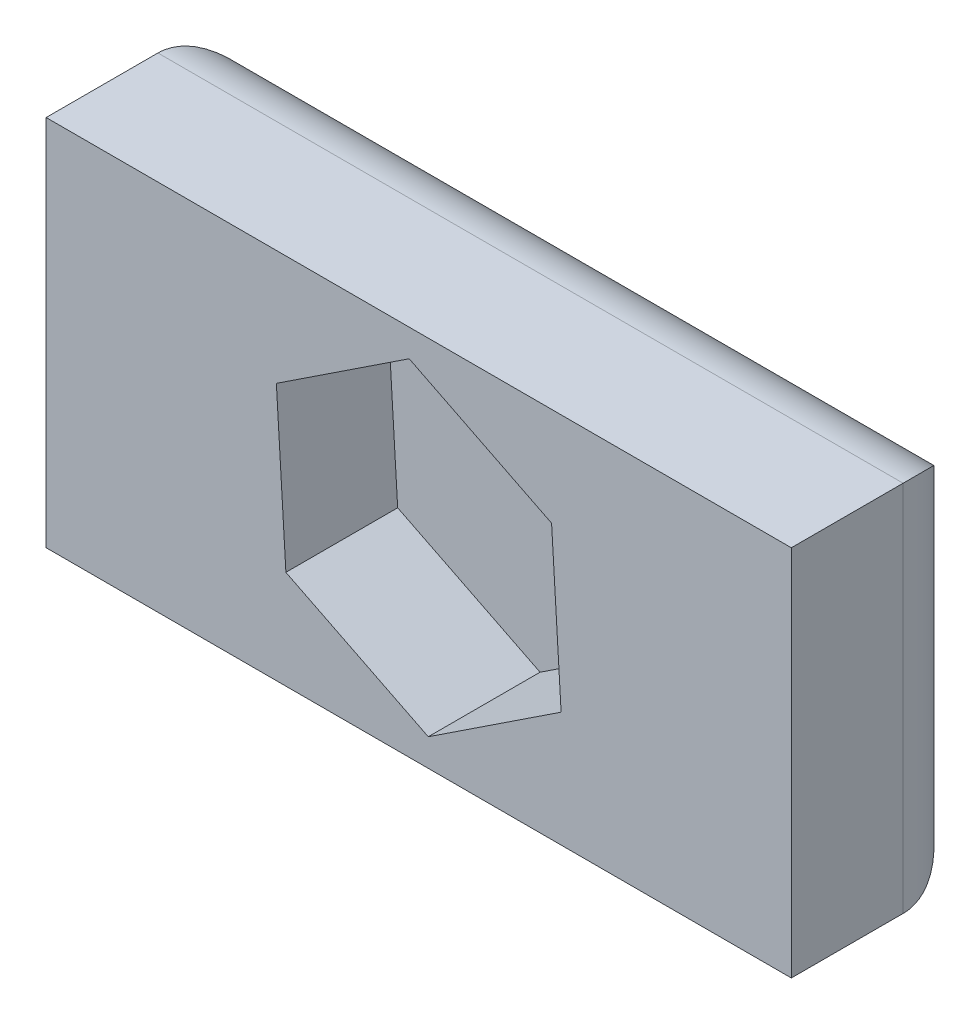
ISO-10303-21;
HEADER;
FILE_DESCRIPTION(('STEP AP214'),'2;1');
FILE_NAME('part.step','',(''),(''),'','','');
FILE_SCHEMA(('AUTOMOTIVE_DESIGN { 1 0 10303 214 1 1 1 1 }'));
ENDSEC;
DATA;
#1=APPLICATION_CONTEXT('core data for automotive mechanical design processes');
#2=APPLICATION_PROTOCOL_DEFINITION('international standard','automotive_design',2000,#1);
#3=PRODUCT_CONTEXT('',#1,'mechanical');
#4=PRODUCT('Part','Part','',(#3));
#5=PRODUCT_RELATED_PRODUCT_CATEGORY('part','',(#4));
#6=PRODUCT_DEFINITION_FORMATION('','',#4);
#7=PRODUCT_DEFINITION_CONTEXT('part definition',#1,'design');
#8=PRODUCT_DEFINITION('design','',#6,#7);
#9=PRODUCT_DEFINITION_SHAPE('','',#8);
#10=(LENGTH_UNIT() NAMED_UNIT(*) SI_UNIT(.MILLI.,.METRE.));
#11=(NAMED_UNIT(*) PLANE_ANGLE_UNIT() SI_UNIT($,.RADIAN.));
#12=(NAMED_UNIT(*) SI_UNIT($,.STERADIAN.) SOLID_ANGLE_UNIT());
#13=UNCERTAINTY_MEASURE_WITH_UNIT(LENGTH_MEASURE(1.E-05),#10,'distance_accuracy_value','');
#14=(GEOMETRIC_REPRESENTATION_CONTEXT(3) GLOBAL_UNCERTAINTY_ASSIGNED_CONTEXT((#13)) GLOBAL_UNIT_ASSIGNED_CONTEXT((#10,
#11,#12)) REPRESENTATION_CONTEXT('',''));
#15=CARTESIAN_POINT('',(0.,0.,0.));
#16=DIRECTION('',(0.,0.,1.));
#17=DIRECTION('',(1.,0.,0.));
#18=AXIS2_PLACEMENT_3D('',#15,#16,#17);
#19=CARTESIAN_POINT('',(10.,-5.,5.));
#20=DIRECTION('',(-1.,0.,0.));
#21=DIRECTION('',(0.,0.,1.));
#22=AXIS2_PLACEMENT_3D('',#19,#20,#21);
#23=PLANE('',#22);
#24=DIRECTION('',(0.,0.,-1.));
#25=VECTOR('',#24,1.);
#26=CARTESIAN_POINT('',(10.,-5.,5.));
#27=LINE('',#26,#25);
#28=CARTESIAN_POINT('',(10.,-5.,5.));
#29=VERTEX_POINT('',#28);
#30=CARTESIAN_POINT('',(10.,-5.,2.));
#31=VERTEX_POINT('',#30);
#32=EDGE_CURVE('E196',#29,#31,#27,.T.);
#33=ORIENTED_EDGE('',*,*,#32,.T.);
#34=DIRECTION('',(0.,1.,0.));
#35=VECTOR('',#34,1.);
#36=CARTESIAN_POINT('',(10.,5.,2.));
#37=LINE('',#36,#35);
#38=CARTESIAN_POINT('',(10.,5.,2.));
#39=VERTEX_POINT('',#38);
#40=EDGE_CURVE('E11',#31,#39,#37,.T.);
#41=ORIENTED_EDGE('',*,*,#40,.T.);
#42=DIRECTION('',(0.,0.,-1.));
#43=VECTOR('',#42,1.);
#44=CARTESIAN_POINT('',(10.,5.,5.));
#45=LINE('',#44,#43);
#46=CARTESIAN_POINT('',(10.,5.,5.));
#47=VERTEX_POINT('',#46);
#48=EDGE_CURVE('E202',#47,#39,#45,.T.);
#49=ORIENTED_EDGE('',*,*,#48,.F.);
#50=DIRECTION('',(0.,1.,0.));
#51=VECTOR('',#50,1.);
#52=CARTESIAN_POINT('',(10.,-5.,5.));
#53=LINE('',#52,#51);
#54=EDGE_CURVE('E180',#29,#47,#53,.T.);
#55=ORIENTED_EDGE('',*,*,#54,.F.);
#56=EDGE_LOOP('',(#33,#41,#49,#55));
#57=FACE_BOUND('',#56,.T.);
#58=ADVANCED_FACE('F37',(#57),#23,.F.);
#59=CARTESIAN_POINT('',(-10.,5.,5.));
#60=DIRECTION('',(0.,-1.,0.));
#61=DIRECTION('',(0.,0.,-1.));
#62=AXIS2_PLACEMENT_3D('',#59,#60,#61);
#63=PLANE('',#62);
#64=ORIENTED_EDGE('',*,*,#48,.T.);
#65=DIRECTION('',(-1.,0.,0.));
#66=VECTOR('',#65,1.);
#67=CARTESIAN_POINT('',(-10.,5.,2.));
#68=LINE('',#67,#66);
#69=CARTESIAN_POINT('',(-10.,5.,2.));
#70=VERTEX_POINT('',#69);
#71=EDGE_CURVE('E205',#39,#70,#68,.T.);
#72=ORIENTED_EDGE('',*,*,#71,.T.);
#73=DIRECTION('',(0.,0.,-1.));
#74=VECTOR('',#73,1.);
#75=CARTESIAN_POINT('',(-10.,5.,5.));
#76=LINE('',#75,#74);
#77=CARTESIAN_POINT('',(-10.,5.,5.));
#78=VERTEX_POINT('',#77);
#79=EDGE_CURVE('E200',#78,#70,#76,.T.);
#80=ORIENTED_EDGE('',*,*,#79,.F.);
#81=DIRECTION('',(-1.,0.,0.));
#82=VECTOR('',#81,1.);
#83=CARTESIAN_POINT('',(-10.,5.,5.));
#84=LINE('',#83,#82);
#85=EDGE_CURVE('E190',#47,#78,#84,.T.);
#86=ORIENTED_EDGE('',*,*,#85,.F.);
#87=EDGE_LOOP('',(#64,#72,#80,#86));
#88=FACE_BOUND('',#87,.T.);
#89=ADVANCED_FACE('F246',(#88),#63,.F.);
#90=CARTESIAN_POINT('',(-10.,-5.,5.));
#91=DIRECTION('',(1.,0.,0.));
#92=DIRECTION('',(0.,0.,-1.));
#93=AXIS2_PLACEMENT_3D('',#90,#91,#92);
#94=PLANE('',#93);
#95=ORIENTED_EDGE('',*,*,#79,.T.);
#96=DIRECTION('',(0.,-1.,0.));
#97=VECTOR('',#96,1.);
#98=CARTESIAN_POINT('',(-10.,-5.,2.));
#99=LINE('',#98,#97);
#100=CARTESIAN_POINT('',(-10.,-5.,2.));
#101=VERTEX_POINT('',#100);
#102=EDGE_CURVE('E61',#70,#101,#99,.T.);
#103=ORIENTED_EDGE('',*,*,#102,.T.);
#104=DIRECTION('',(0.,0.,-1.));
#105=VECTOR('',#104,1.);
#106=CARTESIAN_POINT('',(-10.,-5.,5.));
#107=LINE('',#106,#105);
#108=CARTESIAN_POINT('',(-10.,-5.,5.));
#109=VERTEX_POINT('',#108);
#110=EDGE_CURVE('E198',#109,#101,#107,.T.);
#111=ORIENTED_EDGE('',*,*,#110,.F.);
#112=DIRECTION('',(0.,-1.,0.));
#113=VECTOR('',#112,1.);
#114=CARTESIAN_POINT('',(-10.,-5.,5.));
#115=LINE('',#114,#113);
#116=EDGE_CURVE('E192',#78,#109,#115,.T.);
#117=ORIENTED_EDGE('',*,*,#116,.F.);
#118=EDGE_LOOP('',(#95,#103,#111,#117));
#119=FACE_BOUND('',#118,.T.);
#120=ADVANCED_FACE('F249',(#119),#94,.F.);
#121=CARTESIAN_POINT('',(-10.,-5.,5.));
#122=DIRECTION('',(0.,1.,0.));
#123=DIRECTION('',(0.,0.,1.));
#124=AXIS2_PLACEMENT_3D('',#121,#122,#123);
#125=PLANE('',#124);
#126=ORIENTED_EDGE('',*,*,#110,.T.);
#127=DIRECTION('',(1.,0.,0.));
#128=VECTOR('',#127,1.);
#129=CARTESIAN_POINT('',(10.,-5.,2.));
#130=LINE('',#129,#128);
#131=EDGE_CURVE('E46',#101,#31,#130,.T.);
#132=ORIENTED_EDGE('',*,*,#131,.T.);
#133=ORIENTED_EDGE('',*,*,#32,.F.);
#134=DIRECTION('',(1.,0.,0.));
#135=VECTOR('',#134,1.);
#136=CARTESIAN_POINT('',(-10.,-5.,5.));
#137=LINE('',#136,#135);
#138=EDGE_CURVE('E194',#109,#29,#137,.T.);
#139=ORIENTED_EDGE('',*,*,#138,.F.);
#140=EDGE_LOOP('',(#126,#132,#133,#139));
#141=FACE_BOUND('',#140,.T.);
#142=ADVANCED_FACE('F255',(#141),#125,.F.);
#143=CARTESIAN_POINT('',(0.,0.,5.));
#144=DIRECTION('',(0.,0.,-1.));
#145=DIRECTION('',(-1.,0.,0.));
#146=AXIS2_PLACEMENT_3D('',#143,#144,#145);
#147=PLANE('',#146);
#148=DIRECTION('',(0.8345119301207,0.550989871491504,0.));
#149=VECTOR('',#148,1.);
#150=CARTESIAN_POINT('',(0.255981480779147,-4.26471649876418,5.));
#151=LINE('',#150,#149);
#152=CARTESIAN_POINT('',(0.255981480779148,-4.26471649876418,5.));
#153=VERTEX_POINT('',#152);
#154=CARTESIAN_POINT('',(3.82134356825798,-1.91067178412899,5.));
#155=VERTEX_POINT('',#154);
#156=EDGE_CURVE('E168',#153,#155,#151,.T.);
#157=ORIENTED_EDGE('',*,*,#156,.F.);
#158=DIRECTION('',(0.894427190999916,-0.447213595499958,0.));
#159=VECTOR('',#158,1.);
#160=CARTESIAN_POINT('',(-3.56536208747884,-2.35404471463519,5.));
#161=LINE('',#160,#159);
#162=CARTESIAN_POINT('',(-3.56536208747884,-2.35404471463519,5.));
#163=VERTEX_POINT('',#162);
#164=EDGE_CURVE('E136',#163,#153,#161,.T.);
#165=ORIENTED_EDGE('',*,*,#164,.F.);
#166=DIRECTION('',(0.059915260879216,-0.998203466991462,0.));
#167=VECTOR('',#166,1.);
#168=CARTESIAN_POINT('',(-3.82134356825798,1.91067178412899,5.));
#169=LINE('',#168,#167);
#170=CARTESIAN_POINT('',(-3.82134356825798,1.91067178412899,5.));
#171=VERTEX_POINT('',#170);
#172=EDGE_CURVE('E154',#171,#163,#169,.T.);
#173=ORIENTED_EDGE('',*,*,#172,.F.);
#174=DIRECTION('',(-0.834511930120699,-0.550989871491505,0.));
#175=VECTOR('',#174,1.);
#176=CARTESIAN_POINT('',(-0.255981480779148,4.26471649876419,5.));
#177=LINE('',#176,#175);
#178=CARTESIAN_POINT('',(-0.255981480779148,4.26471649876419,5.));
#179=VERTEX_POINT('',#178);
#180=EDGE_CURVE('E157',#179,#171,#177,.T.);
#181=ORIENTED_EDGE('',*,*,#180,.F.);
#182=DIRECTION('',(-0.894427190999916,0.447213595499958,0.));
#183=VECTOR('',#182,1.);
#184=CARTESIAN_POINT('',(3.56536208747884,2.3540447146352,5.));
#185=LINE('',#184,#183);
#186=CARTESIAN_POINT('',(3.56536208747884,2.3540447146352,5.));
#187=VERTEX_POINT('',#186);
#188=EDGE_CURVE('E173',#187,#179,#185,.T.);
#189=ORIENTED_EDGE('',*,*,#188,.F.);
#190=DIRECTION('',(-0.0599152608792164,0.998203466991462,0.));
#191=VECTOR('',#190,1.);
#192=CARTESIAN_POINT('',(3.82134356825798,-1.91067178412899,5.));
#193=LINE('',#192,#191);
#194=EDGE_CURVE('E170',#155,#187,#193,.T.);
#195=ORIENTED_EDGE('',*,*,#194,.F.);
#196=EDGE_LOOP('',(#157,#165,#173,#181,#189,#195));
#197=FACE_BOUND('',#196,.T.);
#198=ORIENTED_EDGE('',*,*,#54,.T.);
#199=ORIENTED_EDGE('',*,*,#85,.T.);
#200=ORIENTED_EDGE('',*,*,#116,.T.);
#201=ORIENTED_EDGE('',*,*,#138,.T.);
#202=EDGE_LOOP('',(#198,#199,#200,#201));
#203=FACE_BOUND('',#202,.T.);
#204=ADVANCED_FACE('F252',(#197,#203),#147,.F.);
#205=CARTESIAN_POINT('',(0.,0.,0.));
#206=DIRECTION('',(0.,0.,-1.));
#207=DIRECTION('',(-1.,0.,0.));
#208=AXIS2_PLACEMENT_3D('',#205,#206,#207);
#209=PLANE('',#208);
#210=DIRECTION('',(0.,-1.,0.));
#211=VECTOR('',#210,1.);
#212=CARTESIAN_POINT('',(-8.,5.,0.));
#213=LINE('',#212,#211);
#214=CARTESIAN_POINT('',(-8.,-3.,0.));
#215=VERTEX_POINT('',#214);
#216=CARTESIAN_POINT('',(-8.,3.,0.));
#217=VERTEX_POINT('',#216);
#218=EDGE_CURVE('E212',#215,#217,#213,.F.);
#219=ORIENTED_EDGE('',*,*,#218,.T.);
#220=DIRECTION('',(-1.,0.,0.));
#221=VECTOR('',#220,1.);
#222=CARTESIAN_POINT('',(10.,3.,0.));
#223=LINE('',#222,#221);
#224=CARTESIAN_POINT('',(8.,3.,0.));
#225=VERTEX_POINT('',#224);
#226=EDGE_CURVE('E214',#217,#225,#223,.F.);
#227=ORIENTED_EDGE('',*,*,#226,.T.);
#228=DIRECTION('',(0.,1.,0.));
#229=VECTOR('',#228,1.);
#230=CARTESIAN_POINT('',(8.,-5.,0.));
#231=LINE('',#230,#229);
#232=CARTESIAN_POINT('',(8.,-3.,0.));
#233=VERTEX_POINT('',#232);
#234=EDGE_CURVE('E208',#225,#233,#231,.F.);
#235=ORIENTED_EDGE('',*,*,#234,.T.);
#236=DIRECTION('',(1.,0.,0.));
#237=VECTOR('',#236,1.);
#238=CARTESIAN_POINT('',(-10.,-3.,0.));
#239=LINE('',#238,#237);
#240=EDGE_CURVE('E210',#233,#215,#239,.F.);
#241=ORIENTED_EDGE('',*,*,#240,.T.);
#242=EDGE_LOOP('',(#219,#227,#235,#241));
#243=FACE_BOUND('',#242,.T.);
#244=ADVANCED_FACE('F237',(#243),#209,.T.);
#245=CARTESIAN_POINT('',(-3.56536208747884,-2.35404471463519,2.));
#246=DIRECTION('',(-0.447213595499958,-0.894427190999916,0.));
#247=DIRECTION('',(0.894427190999916,-0.447213595499958,0.));
#248=AXIS2_PLACEMENT_3D('',#245,#246,#247);
#249=PLANE('',#248);
#250=ORIENTED_EDGE('',*,*,#164,.T.);
#251=DIRECTION('',(0.,0.,1.));
#252=VECTOR('',#251,1.);
#253=CARTESIAN_POINT('',(0.255981480779147,-4.26471649876418,2.));
#254=LINE('',#253,#252);
#255=CARTESIAN_POINT('',(0.255981480779147,-4.26471649876418,2.));
#256=VERTEX_POINT('',#255);
#257=EDGE_CURVE('E129',#256,#153,#254,.T.);
#258=ORIENTED_EDGE('',*,*,#257,.F.);
#259=DIRECTION('',(0.894427190999916,-0.447213595499958,0.));
#260=VECTOR('',#259,1.);
#261=CARTESIAN_POINT('',(-3.56536208747884,-2.35404471463519,2.));
#262=LINE('',#261,#260);
#263=CARTESIAN_POINT('',(-3.56536208747884,-2.35404471463519,2.));
#264=VERTEX_POINT('',#263);
#265=EDGE_CURVE('E133',#264,#256,#262,.T.);
#266=ORIENTED_EDGE('',*,*,#265,.F.);
#267=DIRECTION('',(0.,0.,1.));
#268=VECTOR('',#267,1.);
#269=CARTESIAN_POINT('',(-3.56536208747884,-2.35404471463519,2.));
#270=LINE('',#269,#268);
#271=EDGE_CURVE('E178',#264,#163,#270,.T.);
#272=ORIENTED_EDGE('',*,*,#271,.T.);
#273=EDGE_LOOP('',(#250,#258,#266,#272));
#274=FACE_BOUND('',#273,.T.);
#275=ADVANCED_FACE('F131',(#274),#249,.F.);
#276=CARTESIAN_POINT('',(-3.82134356825798,1.91067178412899,2.));
#277=DIRECTION('',(-0.998203466991462,-0.0599152608792159,0.));
#278=DIRECTION('',(0.059915260879216,-0.998203466991462,0.));
#279=AXIS2_PLACEMENT_3D('',#276,#277,#278);
#280=PLANE('',#279);
#281=ORIENTED_EDGE('',*,*,#172,.T.);
#282=ORIENTED_EDGE('',*,*,#271,.F.);
#283=DIRECTION('',(0.059915260879216,-0.998203466991462,0.));
#284=VECTOR('',#283,1.);
#285=CARTESIAN_POINT('',(-3.82134356825798,1.91067178412899,2.));
#286=LINE('',#285,#284);
#287=CARTESIAN_POINT('',(-3.82134356825798,1.91067178412899,2.));
#288=VERTEX_POINT('',#287);
#289=EDGE_CURVE('E141',#288,#264,#286,.T.);
#290=ORIENTED_EDGE('',*,*,#289,.F.);
#291=DIRECTION('',(0.,0.,1.));
#292=VECTOR('',#291,1.);
#293=CARTESIAN_POINT('',(-3.82134356825798,1.91067178412899,2.));
#294=LINE('',#293,#292);
#295=EDGE_CURVE('E181',#288,#171,#294,.T.);
#296=ORIENTED_EDGE('',*,*,#295,.T.);
#297=EDGE_LOOP('',(#281,#282,#290,#296));
#298=FACE_BOUND('',#297,.T.);
#299=ADVANCED_FACE('F290',(#298),#280,.F.);
#300=CARTESIAN_POINT('',(-0.255981480779148,4.26471649876419,2.));
#301=DIRECTION('',(-0.550989871491505,0.834511930120699,0.));
#302=DIRECTION('',(-0.834511930120699,-0.550989871491505,0.));
#303=AXIS2_PLACEMENT_3D('',#300,#301,#302);
#304=PLANE('',#303);
#305=ORIENTED_EDGE('',*,*,#180,.T.);
#306=ORIENTED_EDGE('',*,*,#295,.F.);
#307=DIRECTION('',(-0.834511930120699,-0.550989871491505,0.));
#308=VECTOR('',#307,1.);
#309=CARTESIAN_POINT('',(-0.255981480779148,4.26471649876419,2.));
#310=LINE('',#309,#308);
#311=CARTESIAN_POINT('',(-0.255981480779148,4.26471649876419,2.));
#312=VERTEX_POINT('',#311);
#313=EDGE_CURVE('E164',#312,#288,#310,.T.);
#314=ORIENTED_EDGE('',*,*,#313,.F.);
#315=DIRECTION('',(0.,0.,1.));
#316=VECTOR('',#315,1.);
#317=CARTESIAN_POINT('',(-0.255981480779148,4.26471649876419,2.));
#318=LINE('',#317,#316);
#319=EDGE_CURVE('E183',#312,#179,#318,.T.);
#320=ORIENTED_EDGE('',*,*,#319,.T.);
#321=EDGE_LOOP('',(#305,#306,#314,#320));
#322=FACE_BOUND('',#321,.T.);
#323=ADVANCED_FACE('F293',(#322),#304,.F.);
#324=CARTESIAN_POINT('',(3.56536208747884,2.3540447146352,2.));
#325=DIRECTION('',(0.447213595499958,0.894427190999916,0.));
#326=DIRECTION('',(-0.894427190999916,0.447213595499958,0.));
#327=AXIS2_PLACEMENT_3D('',#324,#325,#326);
#328=PLANE('',#327);
#329=ORIENTED_EDGE('',*,*,#188,.T.);
#330=ORIENTED_EDGE('',*,*,#319,.F.);
#331=DIRECTION('',(-0.894427190999916,0.447213595499958,0.));
#332=VECTOR('',#331,1.);
#333=CARTESIAN_POINT('',(3.56536208747884,2.3540447146352,2.));
#334=LINE('',#333,#332);
#335=CARTESIAN_POINT('',(3.56536208747884,2.3540447146352,2.));
#336=VERTEX_POINT('',#335);
#337=EDGE_CURVE('E161',#336,#312,#334,.T.);
#338=ORIENTED_EDGE('',*,*,#337,.F.);
#339=DIRECTION('',(0.,0.,1.));
#340=VECTOR('',#339,1.);
#341=CARTESIAN_POINT('',(3.56536208747884,2.3540447146352,2.));
#342=LINE('',#341,#340);
#343=EDGE_CURVE('E185',#336,#187,#342,.T.);
#344=ORIENTED_EDGE('',*,*,#343,.T.);
#345=EDGE_LOOP('',(#329,#330,#338,#344));
#346=FACE_BOUND('',#345,.T.);
#347=ADVANCED_FACE('F297',(#346),#328,.F.);
#348=CARTESIAN_POINT('',(3.82134356825798,-1.91067178412899,2.));
#349=DIRECTION('',(0.998203466991462,0.0599152608792164,0.));
#350=DIRECTION('',(-0.0599152608792164,0.998203466991462,0.));
#351=AXIS2_PLACEMENT_3D('',#348,#349,#350);
#352=PLANE('',#351);
#353=ORIENTED_EDGE('',*,*,#194,.T.);
#354=ORIENTED_EDGE('',*,*,#343,.F.);
#355=DIRECTION('',(-0.0599152608792164,0.998203466991462,0.));
#356=VECTOR('',#355,1.);
#357=CARTESIAN_POINT('',(3.82134356825798,-1.91067178412899,2.));
#358=LINE('',#357,#356);
#359=CARTESIAN_POINT('',(3.82134356825798,-1.91067178412899,2.));
#360=VERTEX_POINT('',#359);
#361=EDGE_CURVE('E149',#360,#336,#358,.T.);
#362=ORIENTED_EDGE('',*,*,#361,.F.);
#363=DIRECTION('',(0.,0.,1.));
#364=VECTOR('',#363,1.);
#365=CARTESIAN_POINT('',(3.82134356825798,-1.91067178412899,2.));
#366=LINE('',#365,#364);
#367=EDGE_CURVE('E140',#360,#155,#366,.T.);
#368=ORIENTED_EDGE('',*,*,#367,.T.);
#369=EDGE_LOOP('',(#353,#354,#362,#368));
#370=FACE_BOUND('',#369,.T.);
#371=ADVANCED_FACE('F287',(#370),#352,.F.);
#372=CARTESIAN_POINT('',(0.255981480779147,-4.26471649876418,2.));
#373=DIRECTION('',(0.550989871491504,-0.8345119301207,0.));
#374=DIRECTION('',(0.8345119301207,0.550989871491504,0.));
#375=AXIS2_PLACEMENT_3D('',#372,#373,#374);
#376=PLANE('',#375);
#377=ORIENTED_EDGE('',*,*,#156,.T.);
#378=ORIENTED_EDGE('',*,*,#367,.F.);
#379=DIRECTION('',(0.8345119301207,0.550989871491504,0.));
#380=VECTOR('',#379,1.);
#381=CARTESIAN_POINT('',(0.255981480779147,-4.26471649876418,2.));
#382=LINE('',#381,#380);
#383=EDGE_CURVE('E144',#256,#360,#382,.T.);
#384=ORIENTED_EDGE('',*,*,#383,.F.);
#385=ORIENTED_EDGE('',*,*,#257,.T.);
#386=EDGE_LOOP('',(#377,#378,#384,#385));
#387=FACE_BOUND('',#386,.T.);
#388=ADVANCED_FACE('F145',(#387),#376,.F.);
#389=CARTESIAN_POINT('',(0.,0.,2.));
#390=DIRECTION('',(0.,0.,1.));
#391=DIRECTION('',(1.,0.,0.));
#392=AXIS2_PLACEMENT_3D('',#389,#390,#391);
#393=PLANE('',#392);
#394=ORIENTED_EDGE('',*,*,#265,.T.);
#395=ORIENTED_EDGE('',*,*,#383,.T.);
#396=ORIENTED_EDGE('',*,*,#361,.T.);
#397=ORIENTED_EDGE('',*,*,#337,.T.);
#398=ORIENTED_EDGE('',*,*,#313,.T.);
#399=ORIENTED_EDGE('',*,*,#289,.T.);
#400=EDGE_LOOP('',(#394,#395,#396,#397,#398,#399));
#401=FACE_BOUND('',#400,.T.);
#402=ADVANCED_FACE('F151',(#401),#393,.T.);
#403=CARTESIAN_POINT('',(-10.,-3.,2.));
#404=DIRECTION('',(-1.,0.,0.));
#405=DIRECTION('',(0.,0.,1.));
#406=AXIS2_PLACEMENT_3D('',#403,#404,#405);
#407=CYLINDRICAL_SURFACE('',#406,2.);
#408=CARTESIAN_POINT('',(-8.,-3.,2.));
#409=DIRECTION('',(-0.707106781186547,0.707106781186547,0.));
#410=DIRECTION('',(-0.707106781186547,-0.707106781186547,0.));
#411=AXIS2_PLACEMENT_3D('',#408,#409,#410);
#412=ELLIPSE('',#411,2.82842712474619,2.);
#413=EDGE_CURVE('E222',#215,#101,#412,.T.);
#414=ORIENTED_EDGE('',*,*,#413,.F.);
#415=ORIENTED_EDGE('',*,*,#240,.F.);
#416=CARTESIAN_POINT('',(8.,-3.,2.));
#417=DIRECTION('',(-0.707106781186547,-0.707106781186547,0.));
#418=DIRECTION('',(0.707106781186547,-0.707106781186547,0.));
#419=AXIS2_PLACEMENT_3D('',#416,#417,#418);
#420=ELLIPSE('',#419,2.82842712474619,2.);
#421=EDGE_CURVE('E41',#31,#233,#420,.F.);
#422=ORIENTED_EDGE('',*,*,#421,.F.);
#423=ORIENTED_EDGE('',*,*,#131,.F.);
#424=EDGE_LOOP('',(#414,#415,#422,#423));
#425=FACE_BOUND('',#424,.T.);
#426=ADVANCED_FACE('F39',(#425),#407,.T.);
#427=CARTESIAN_POINT('',(8.,-5.,2.));
#428=DIRECTION('',(0.,-1.,0.));
#429=DIRECTION('',(0.,0.,-1.));
#430=AXIS2_PLACEMENT_3D('',#427,#428,#429);
#431=CYLINDRICAL_SURFACE('',#430,2.);
#432=ORIENTED_EDGE('',*,*,#421,.T.);
#433=ORIENTED_EDGE('',*,*,#234,.F.);
#434=CARTESIAN_POINT('',(8.,3.,2.));
#435=DIRECTION('',(0.707106781186547,-0.707106781186547,0.));
#436=DIRECTION('',(-0.707106781186547,-0.707106781186547,0.));
#437=AXIS2_PLACEMENT_3D('',#434,#435,#436);
#438=ELLIPSE('',#437,2.82842712474619,2.);
#439=EDGE_CURVE('E221',#39,#225,#438,.F.);
#440=ORIENTED_EDGE('',*,*,#439,.F.);
#441=ORIENTED_EDGE('',*,*,#40,.F.);
#442=EDGE_LOOP('',(#432,#433,#440,#441));
#443=FACE_BOUND('',#442,.T.);
#444=ADVANCED_FACE('F232',(#443),#431,.T.);
#445=CARTESIAN_POINT('',(-8.,-5.,2.));
#446=DIRECTION('',(0.,1.,0.));
#447=DIRECTION('',(0.,0.,1.));
#448=AXIS2_PLACEMENT_3D('',#445,#446,#447);
#449=CYLINDRICAL_SURFACE('',#448,2.);
#450=ORIENTED_EDGE('',*,*,#413,.T.);
#451=ORIENTED_EDGE('',*,*,#102,.F.);
#452=CARTESIAN_POINT('',(-8.,3.,2.));
#453=DIRECTION('',(0.707106781186547,0.707106781186547,0.));
#454=DIRECTION('',(-0.707106781186547,0.707106781186547,0.));
#455=AXIS2_PLACEMENT_3D('',#452,#453,#454);
#456=ELLIPSE('',#455,2.82842712474619,2.);
#457=EDGE_CURVE('E219',#217,#70,#456,.T.);
#458=ORIENTED_EDGE('',*,*,#457,.F.);
#459=ORIENTED_EDGE('',*,*,#218,.F.);
#460=EDGE_LOOP('',(#450,#451,#458,#459));
#461=FACE_BOUND('',#460,.T.);
#462=ADVANCED_FACE('F243',(#461),#449,.T.);
#463=CARTESIAN_POINT('',(-10.,3.,2.));
#464=DIRECTION('',(1.,0.,0.));
#465=DIRECTION('',(0.,0.,-1.));
#466=AXIS2_PLACEMENT_3D('',#463,#464,#465);
#467=CYLINDRICAL_SURFACE('',#466,2.);
#468=ORIENTED_EDGE('',*,*,#439,.T.);
#469=ORIENTED_EDGE('',*,*,#226,.F.);
#470=ORIENTED_EDGE('',*,*,#457,.T.);
#471=ORIENTED_EDGE('',*,*,#71,.F.);
#472=EDGE_LOOP('',(#468,#469,#470,#471));
#473=FACE_BOUND('',#472,.T.);
#474=ADVANCED_FACE('F241',(#473),#467,.T.);
#475=CLOSED_SHELL('',(#58,#89,#120,#142,#204,#244,#275,#299,#323,#347,#371,#388,#402,#426,#444,
#462,#474));
#476=MANIFOLD_SOLID_BREP('B2',#475);
#477=ADVANCED_BREP_SHAPE_REPRESENTATION('',(#18,#476),#14);
#478=SHAPE_DEFINITION_REPRESENTATION(#9,#477);
ENDSEC;
END-ISO-10303-21;
